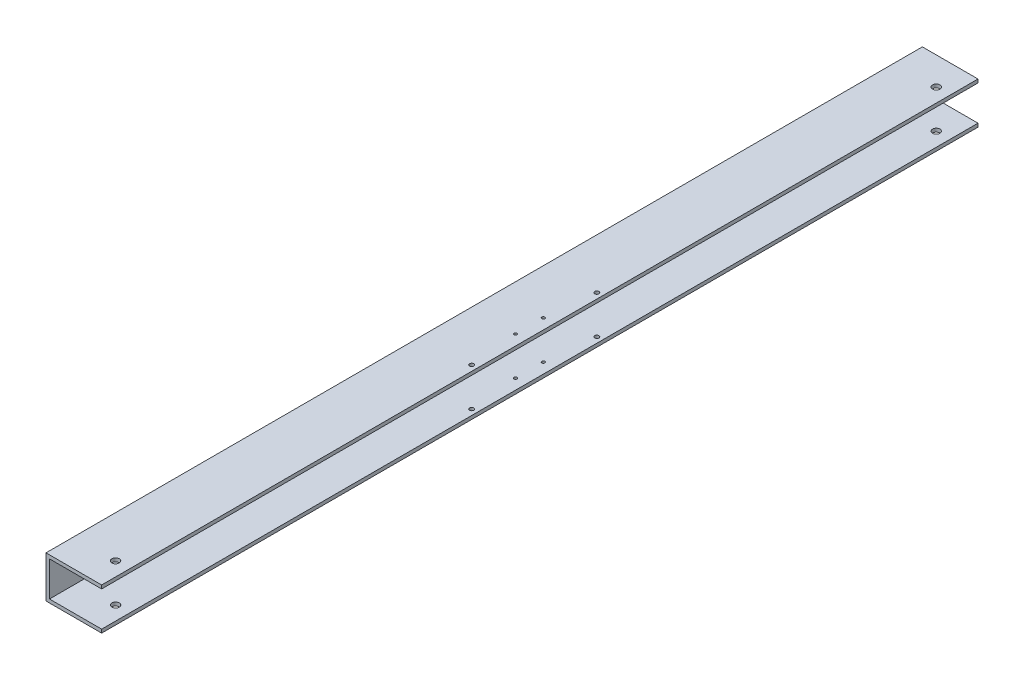
ISO-10303-21;
HEADER;
FILE_DESCRIPTION(('STEP AP214'),'2;1');
FILE_NAME('part.step','',(''),(''),'','','');
FILE_SCHEMA(('AUTOMOTIVE_DESIGN { 1 0 10303 214 1 1 1 1 }'));
ENDSEC;
DATA;
#1=APPLICATION_CONTEXT('core data for automotive mechanical design processes');
#2=APPLICATION_PROTOCOL_DEFINITION('international standard','automotive_design',2000,#1);
#3=PRODUCT_CONTEXT('',#1,'mechanical');
#4=PRODUCT('Part','Part','',(#3));
#5=PRODUCT_RELATED_PRODUCT_CATEGORY('part','',(#4));
#6=PRODUCT_DEFINITION_FORMATION('','',#4);
#7=PRODUCT_DEFINITION_CONTEXT('part definition',#1,'design');
#8=PRODUCT_DEFINITION('design','',#6,#7);
#9=PRODUCT_DEFINITION_SHAPE('','',#8);
#10=(LENGTH_UNIT() NAMED_UNIT(*) SI_UNIT(.MILLI.,.METRE.));
#11=(NAMED_UNIT(*) PLANE_ANGLE_UNIT() SI_UNIT($,.RADIAN.));
#12=(NAMED_UNIT(*) SI_UNIT($,.STERADIAN.) SOLID_ANGLE_UNIT());
#13=UNCERTAINTY_MEASURE_WITH_UNIT(LENGTH_MEASURE(1.E-05),#10,'distance_accuracy_value','');
#14=(GEOMETRIC_REPRESENTATION_CONTEXT(3) GLOBAL_UNCERTAINTY_ASSIGNED_CONTEXT((#13)) GLOBAL_UNIT_ASSIGNED_CONTEXT((#10,
#11,#12)) REPRESENTATION_CONTEXT('',''));
#15=CARTESIAN_POINT('',(0.,0.,0.));
#16=DIRECTION('',(0.,0.,1.));
#17=DIRECTION('',(1.,0.,0.));
#18=AXIS2_PLACEMENT_3D('',#15,#16,#17);
#19=CARTESIAN_POINT('',(-25.4,19.05,400.05));
#20=DIRECTION('',(0.,-1.,0.));
#21=DIRECTION('',(0.,0.,-1.));
#22=AXIS2_PLACEMENT_3D('',#19,#20,#21);
#23=PLANE('',#22);
#24=CARTESIAN_POINT('',(12.7,19.05,374.65));
#25=DIRECTION('',(0.,1.,0.));
#26=DIRECTION('',(0.,0.,1.));
#27=AXIS2_PLACEMENT_3D('',#24,#25,#26);
#28=CIRCLE('',#27,3.37819999999999);
#29=CARTESIAN_POINT('',(12.7,19.05,378.0282));
#30=VERTEX_POINT('',#29);
#31=EDGE_CURVE('E198',#30,#30,#28,.T.);
#32=ORIENTED_EDGE('',*,*,#31,.F.);
#33=EDGE_LOOP('',(#32));
#34=FACE_BOUND('',#33,.T.);
#35=CARTESIAN_POINT('',(20.32,19.05,57.15));
#36=DIRECTION('',(0.,1.,0.));
#37=DIRECTION('',(0.,0.,1.));
#38=AXIS2_PLACEMENT_3D('',#35,#36,#37);
#39=CIRCLE('',#38,1.89865);
#40=CARTESIAN_POINT('',(20.32,19.05,59.04865));
#41=VERTEX_POINT('',#40);
#42=EDGE_CURVE('E210',#41,#41,#39,.T.);
#43=ORIENTED_EDGE('',*,*,#42,.F.);
#44=EDGE_LOOP('',(#43));
#45=FACE_BOUND('',#44,.T.);
#46=CARTESIAN_POINT('',(15.8749999999999,19.05,12.7));
#47=DIRECTION('',(0.,1.,0.));
#48=DIRECTION('',(0.,0.,1.));
#49=AXIS2_PLACEMENT_3D('',#46,#47,#48);
#50=CIRCLE('',#49,1.35254999999999);
#51=CARTESIAN_POINT('',(15.8749999999999,19.05,14.05255));
#52=VERTEX_POINT('',#51);
#53=EDGE_CURVE('E226',#52,#52,#50,.T.);
#54=ORIENTED_EDGE('',*,*,#53,.F.);
#55=EDGE_LOOP('',(#54));
#56=FACE_BOUND('',#55,.T.);
#57=DIRECTION('',(-1.,0.,0.));
#58=VECTOR('',#57,1.);
#59=CARTESIAN_POINT('',(-25.4,19.05,-400.05));
#60=LINE('',#59,#58);
#61=CARTESIAN_POINT('',(25.4,19.05,-400.05));
#62=VERTEX_POINT('',#61);
#63=CARTESIAN_POINT('',(-25.4,19.05,-400.05));
#64=VERTEX_POINT('',#63);
#65=EDGE_CURVE('E128',#62,#64,#60,.T.);
#66=ORIENTED_EDGE('',*,*,#65,.T.);
#67=DIRECTION('',(0.,0.,-1.));
#68=VECTOR('',#67,1.);
#69=CARTESIAN_POINT('',(-25.4,19.05,400.05));
#70=LINE('',#69,#68);
#71=CARTESIAN_POINT('',(-25.4,19.05,400.05));
#72=VERTEX_POINT('',#71);
#73=EDGE_CURVE('E125',#72,#64,#70,.T.);
#74=ORIENTED_EDGE('',*,*,#73,.F.);
#75=DIRECTION('',(-1.,0.,0.));
#76=VECTOR('',#75,1.);
#77=CARTESIAN_POINT('',(-25.4,19.05,400.05));
#78=LINE('',#77,#76);
#79=CARTESIAN_POINT('',(25.4,19.05,400.05));
#80=VERTEX_POINT('',#79);
#81=EDGE_CURVE('E114',#80,#72,#78,.T.);
#82=ORIENTED_EDGE('',*,*,#81,.F.);
#83=DIRECTION('',(0.,0.,-1.));
#84=VECTOR('',#83,1.);
#85=CARTESIAN_POINT('',(25.4,19.05,400.05));
#86=LINE('',#85,#84);
#87=EDGE_CURVE('E129',#80,#62,#86,.T.);
#88=ORIENTED_EDGE('',*,*,#87,.T.);
#89=EDGE_LOOP('',(#66,#74,#82,#88));
#90=FACE_BOUND('',#89,.T.);
#91=CARTESIAN_POINT('',(12.7,19.05,-374.65));
#92=DIRECTION('',(0.,1.,0.));
#93=DIRECTION('',(0.,0.,1.));
#94=AXIS2_PLACEMENT_3D('',#91,#92,#93);
#95=CIRCLE('',#94,3.37819999999999);
#96=CARTESIAN_POINT('',(12.7,19.05,-371.2718));
#97=VERTEX_POINT('',#96);
#98=EDGE_CURVE('E192',#97,#97,#95,.T.);
#99=ORIENTED_EDGE('',*,*,#98,.F.);
#100=EDGE_LOOP('',(#99));
#101=FACE_BOUND('',#100,.T.);
#102=CARTESIAN_POINT('',(15.8749999999999,19.05,-12.7));
#103=DIRECTION('',(0.,1.,0.));
#104=DIRECTION('',(0.,0.,1.));
#105=AXIS2_PLACEMENT_3D('',#102,#103,#104);
#106=CIRCLE('',#105,1.35254999999999);
#107=CARTESIAN_POINT('',(15.8749999999999,19.05,-11.34745));
#108=VERTEX_POINT('',#107);
#109=EDGE_CURVE('E177',#108,#108,#106,.T.);
#110=ORIENTED_EDGE('',*,*,#109,.F.);
#111=EDGE_LOOP('',(#110));
#112=FACE_BOUND('',#111,.T.);
#113=CARTESIAN_POINT('',(20.32,19.05,-57.15));
#114=DIRECTION('',(0.,1.,0.));
#115=DIRECTION('',(0.,0.,1.));
#116=AXIS2_PLACEMENT_3D('',#113,#114,#115);
#117=CIRCLE('',#116,1.89865);
#118=CARTESIAN_POINT('',(20.32,19.05,-55.25135));
#119=VERTEX_POINT('',#118);
#120=EDGE_CURVE('E276',#119,#119,#117,.T.);
#121=ORIENTED_EDGE('',*,*,#120,.F.);
#122=EDGE_LOOP('',(#121));
#123=FACE_BOUND('',#122,.T.);
#124=ADVANCED_FACE('F38',(#34,#45,#56,#90,#101,#112,#123),#23,.F.);
#125=CARTESIAN_POINT('',(-25.4,-19.05,400.05));
#126=DIRECTION('',(0.,1.,0.));
#127=DIRECTION('',(0.,0.,1.));
#128=AXIS2_PLACEMENT_3D('',#125,#126,#127);
#129=PLANE('',#128);
#130=CARTESIAN_POINT('',(12.7,-19.05,-374.65));
#131=DIRECTION('',(0.,-1.,0.));
#132=DIRECTION('',(0.,0.,-1.));
#133=AXIS2_PLACEMENT_3D('',#130,#131,#132);
#134=CIRCLE('',#133,3.37819999999999);
#135=CARTESIAN_POINT('',(12.7,-19.05,-378.0282));
#136=VERTEX_POINT('',#135);
#137=EDGE_CURVE('E174',#136,#136,#134,.T.);
#138=ORIENTED_EDGE('',*,*,#137,.F.);
#139=EDGE_LOOP('',(#138));
#140=FACE_BOUND('',#139,.T.);
#141=CARTESIAN_POINT('',(12.7,-19.05,374.65));
#142=DIRECTION('',(0.,-1.,0.));
#143=DIRECTION('',(0.,0.,-1.));
#144=AXIS2_PLACEMENT_3D('',#141,#142,#143);
#145=CIRCLE('',#144,3.37819999999999);
#146=CARTESIAN_POINT('',(12.7,-19.05,371.2718));
#147=VERTEX_POINT('',#146);
#148=EDGE_CURVE('E204',#147,#147,#145,.T.);
#149=ORIENTED_EDGE('',*,*,#148,.F.);
#150=EDGE_LOOP('',(#149));
#151=FACE_BOUND('',#150,.T.);
#152=DIRECTION('',(1.,0.,0.));
#153=VECTOR('',#152,1.);
#154=CARTESIAN_POINT('',(-25.4,-19.05,-400.05));
#155=LINE('',#154,#153);
#156=CARTESIAN_POINT('',(-25.4,-19.05,-400.05));
#157=VERTEX_POINT('',#156);
#158=CARTESIAN_POINT('',(25.4,-19.05,-400.05));
#159=VERTEX_POINT('',#158);
#160=EDGE_CURVE('E93',#157,#159,#155,.T.);
#161=ORIENTED_EDGE('',*,*,#160,.T.);
#162=DIRECTION('',(0.,0.,-1.));
#163=VECTOR('',#162,1.);
#164=CARTESIAN_POINT('',(25.4,-19.05,400.05));
#165=LINE('',#164,#163);
#166=CARTESIAN_POINT('',(25.4,-19.05,400.05));
#167=VERTEX_POINT('',#166);
#168=EDGE_CURVE('E134',#167,#159,#165,.T.);
#169=ORIENTED_EDGE('',*,*,#168,.F.);
#170=DIRECTION('',(1.,0.,0.));
#171=VECTOR('',#170,1.);
#172=CARTESIAN_POINT('',(-25.4,-19.05,400.05));
#173=LINE('',#172,#171);
#174=CARTESIAN_POINT('',(-25.4,-19.05,400.05));
#175=VERTEX_POINT('',#174);
#176=EDGE_CURVE('E58',#175,#167,#173,.T.);
#177=ORIENTED_EDGE('',*,*,#176,.F.);
#178=DIRECTION('',(0.,0.,-1.));
#179=VECTOR('',#178,1.);
#180=CARTESIAN_POINT('',(-25.4,-19.05,400.05));
#181=LINE('',#180,#179);
#182=EDGE_CURVE('E130',#175,#157,#181,.T.);
#183=ORIENTED_EDGE('',*,*,#182,.T.);
#184=EDGE_LOOP('',(#161,#169,#177,#183));
#185=FACE_BOUND('',#184,.T.);
#186=CARTESIAN_POINT('',(15.8749999999999,-19.05,12.7));
#187=DIRECTION('',(0.,1.,0.));
#188=DIRECTION('',(0.,0.,1.));
#189=AXIS2_PLACEMENT_3D('',#186,#187,#188);
#190=CIRCLE('',#189,1.35254999999999);
#191=CARTESIAN_POINT('',(15.8749999999999,-19.05,14.05255));
#192=VERTEX_POINT('',#191);
#193=EDGE_CURVE('E227',#192,#192,#190,.F.);
#194=ORIENTED_EDGE('',*,*,#193,.F.);
#195=EDGE_LOOP('',(#194));
#196=FACE_BOUND('',#195,.T.);
#197=CARTESIAN_POINT('',(20.32,-19.05,57.15));
#198=DIRECTION('',(0.,1.,0.));
#199=DIRECTION('',(0.,0.,1.));
#200=AXIS2_PLACEMENT_3D('',#197,#198,#199);
#201=CIRCLE('',#200,1.89864999999999);
#202=CARTESIAN_POINT('',(20.32,-19.05,59.04865));
#203=VERTEX_POINT('',#202);
#204=EDGE_CURVE('E211',#203,#203,#201,.F.);
#205=ORIENTED_EDGE('',*,*,#204,.F.);
#206=EDGE_LOOP('',(#205));
#207=FACE_BOUND('',#206,.T.);
#208=CARTESIAN_POINT('',(15.8749999999999,-19.05,-12.7));
#209=DIRECTION('',(0.,1.,0.));
#210=DIRECTION('',(0.,0.,1.));
#211=AXIS2_PLACEMENT_3D('',#208,#209,#210);
#212=CIRCLE('',#211,1.35254999999999);
#213=CARTESIAN_POINT('',(15.8749999999999,-19.05,-11.34745));
#214=VERTEX_POINT('',#213);
#215=EDGE_CURVE('E170',#214,#214,#212,.F.);
#216=ORIENTED_EDGE('',*,*,#215,.F.);
#217=EDGE_LOOP('',(#216));
#218=FACE_BOUND('',#217,.T.);
#219=CARTESIAN_POINT('',(20.32,-19.05,-57.15));
#220=DIRECTION('',(0.,1.,0.));
#221=DIRECTION('',(0.,0.,1.));
#222=AXIS2_PLACEMENT_3D('',#219,#220,#221);
#223=CIRCLE('',#222,1.89864999999999);
#224=CARTESIAN_POINT('',(20.32,-19.05,-55.25135));
#225=VERTEX_POINT('',#224);
#226=EDGE_CURVE('E274',#225,#225,#223,.F.);
#227=ORIENTED_EDGE('',*,*,#226,.F.);
#228=EDGE_LOOP('',(#227));
#229=FACE_BOUND('',#228,.T.);
#230=ADVANCED_FACE('F262',(#140,#151,#185,#196,#207,#218,#229),#129,.F.);
#231=CARTESIAN_POINT('',(25.4,-15.875,400.05));
#232=DIRECTION('',(-1.,0.,0.));
#233=DIRECTION('',(0.,0.,1.));
#234=AXIS2_PLACEMENT_3D('',#231,#232,#233);
#235=PLANE('',#234);
#236=DIRECTION('',(0.,1.,0.));
#237=VECTOR('',#236,1.);
#238=CARTESIAN_POINT('',(25.4,-15.875,-400.05));
#239=LINE('',#238,#237);
#240=CARTESIAN_POINT('',(25.4,-15.875,-400.05));
#241=VERTEX_POINT('',#240);
#242=EDGE_CURVE('E138',#159,#241,#239,.T.);
#243=ORIENTED_EDGE('',*,*,#242,.T.);
#244=DIRECTION('',(0.,0.,-1.));
#245=VECTOR('',#244,1.);
#246=CARTESIAN_POINT('',(25.4,-15.875,400.05));
#247=LINE('',#246,#245);
#248=CARTESIAN_POINT('',(25.4,-15.875,400.05));
#249=VERTEX_POINT('',#248);
#250=EDGE_CURVE('E11',#249,#241,#247,.T.);
#251=ORIENTED_EDGE('',*,*,#250,.F.);
#252=DIRECTION('',(0.,1.,0.));
#253=VECTOR('',#252,1.);
#254=CARTESIAN_POINT('',(25.4,-15.875,400.05));
#255=LINE('',#254,#253);
#256=EDGE_CURVE('E153',#167,#249,#255,.T.);
#257=ORIENTED_EDGE('',*,*,#256,.F.);
#258=ORIENTED_EDGE('',*,*,#168,.T.);
#259=EDGE_LOOP('',(#243,#251,#257,#258));
#260=FACE_BOUND('',#259,.T.);
#261=ADVANCED_FACE('F40',(#260),#235,.F.);
#262=CARTESIAN_POINT('',(-22.225,-15.875,400.05));
#263=DIRECTION('',(0.,-1.,0.));
#264=DIRECTION('',(0.,0.,-1.));
#265=AXIS2_PLACEMENT_3D('',#262,#263,#264);
#266=PLANE('',#265);
#267=CARTESIAN_POINT('',(20.32,-15.875,-57.15));
#268=DIRECTION('',(0.,-1.,0.));
#269=DIRECTION('',(0.,0.,-1.));
#270=AXIS2_PLACEMENT_3D('',#267,#268,#269);
#271=CIRCLE('',#270,1.89864999999999);
#272=CARTESIAN_POINT('',(20.32,-15.875,-55.25135));
#273=VERTEX_POINT('',#272);
#274=EDGE_CURVE('E182',#273,#273,#271,.T.);
#275=ORIENTED_EDGE('',*,*,#274,.T.);
#276=EDGE_LOOP('',(#275));
#277=FACE_BOUND('',#276,.T.);
#278=CARTESIAN_POINT('',(15.8749999999999,-15.875,-12.7));
#279=DIRECTION('',(0.,-1.,0.));
#280=DIRECTION('',(0.,0.,-1.));
#281=AXIS2_PLACEMENT_3D('',#278,#279,#280);
#282=CIRCLE('',#281,1.35254999999999);
#283=CARTESIAN_POINT('',(15.8749999999999,-15.875,-11.34745));
#284=VERTEX_POINT('',#283);
#285=EDGE_CURVE('E169',#284,#284,#282,.T.);
#286=ORIENTED_EDGE('',*,*,#285,.T.);
#287=EDGE_LOOP('',(#286));
#288=FACE_BOUND('',#287,.T.);
#289=CARTESIAN_POINT('',(12.7,-15.875,-374.65));
#290=DIRECTION('',(0.,-1.,0.));
#291=DIRECTION('',(0.,0.,-1.));
#292=AXIS2_PLACEMENT_3D('',#289,#290,#291);
#293=CIRCLE('',#292,3.37819999999999);
#294=CARTESIAN_POINT('',(12.7,-15.875,-378.0282));
#295=VERTEX_POINT('',#294);
#296=EDGE_CURVE('E189',#295,#295,#293,.T.);
#297=ORIENTED_EDGE('',*,*,#296,.T.);
#298=EDGE_LOOP('',(#297));
#299=FACE_BOUND('',#298,.T.);
#300=CARTESIAN_POINT('',(12.7,-15.875,374.65));
#301=DIRECTION('',(0.,-1.,0.));
#302=DIRECTION('',(0.,0.,-1.));
#303=AXIS2_PLACEMENT_3D('',#300,#301,#302);
#304=CIRCLE('',#303,3.37819999999999);
#305=CARTESIAN_POINT('',(12.7,-15.875,371.2718));
#306=VERTEX_POINT('',#305);
#307=EDGE_CURVE('E207',#306,#306,#304,.T.);
#308=ORIENTED_EDGE('',*,*,#307,.T.);
#309=EDGE_LOOP('',(#308));
#310=FACE_BOUND('',#309,.T.);
#311=CARTESIAN_POINT('',(20.32,-15.875,57.15));
#312=DIRECTION('',(0.,-1.,0.));
#313=DIRECTION('',(0.,0.,-1.));
#314=AXIS2_PLACEMENT_3D('',#311,#312,#313);
#315=CIRCLE('',#314,1.89864999999999);
#316=CARTESIAN_POINT('',(20.32,-15.875,59.04865));
#317=VERTEX_POINT('',#316);
#318=EDGE_CURVE('E222',#317,#317,#315,.T.);
#319=ORIENTED_EDGE('',*,*,#318,.T.);
#320=EDGE_LOOP('',(#319));
#321=FACE_BOUND('',#320,.T.);
#322=CARTESIAN_POINT('',(15.8749999999999,-15.875,12.7));
#323=DIRECTION('',(0.,-1.,0.));
#324=DIRECTION('',(0.,0.,-1.));
#325=AXIS2_PLACEMENT_3D('',#322,#323,#324);
#326=CIRCLE('',#325,1.35254999999999);
#327=CARTESIAN_POINT('',(15.8749999999999,-15.875,14.05255));
#328=VERTEX_POINT('',#327);
#329=EDGE_CURVE('E142',#328,#328,#326,.T.);
#330=ORIENTED_EDGE('',*,*,#329,.T.);
#331=EDGE_LOOP('',(#330));
#332=FACE_BOUND('',#331,.T.);
#333=DIRECTION('',(-1.,0.,0.));
#334=VECTOR('',#333,1.);
#335=CARTESIAN_POINT('',(-22.225,-15.875,-400.05));
#336=LINE('',#335,#334);
#337=CARTESIAN_POINT('',(-22.225,-15.875,-400.05));
#338=VERTEX_POINT('',#337);
#339=EDGE_CURVE('E141',#241,#338,#336,.T.);
#340=ORIENTED_EDGE('',*,*,#339,.T.);
#341=DIRECTION('',(0.,0.,-1.));
#342=VECTOR('',#341,1.);
#343=CARTESIAN_POINT('',(-22.225,-15.875,400.05));
#344=LINE('',#343,#342);
#345=CARTESIAN_POINT('',(-22.225,-15.875,400.05));
#346=VERTEX_POINT('',#345);
#347=EDGE_CURVE('E49',#346,#338,#344,.T.);
#348=ORIENTED_EDGE('',*,*,#347,.F.);
#349=DIRECTION('',(-1.,0.,0.));
#350=VECTOR('',#349,1.);
#351=CARTESIAN_POINT('',(-22.225,-15.875,400.05));
#352=LINE('',#351,#350);
#353=EDGE_CURVE('E101',#249,#346,#352,.T.);
#354=ORIENTED_EDGE('',*,*,#353,.F.);
#355=ORIENTED_EDGE('',*,*,#250,.T.);
#356=EDGE_LOOP('',(#340,#348,#354,#355));
#357=FACE_BOUND('',#356,.T.);
#358=ADVANCED_FACE('F301',(#277,#288,#299,#310,#321,#332,#357),#266,.F.);
#359=CARTESIAN_POINT('',(-22.225,15.875,400.05));
#360=DIRECTION('',(-1.,0.,0.));
#361=DIRECTION('',(0.,-1.,0.));
#362=AXIS2_PLACEMENT_3D('',#359,#360,#361);
#363=PLANE('',#362);
#364=DIRECTION('',(0.,1.,0.));
#365=VECTOR('',#364,1.);
#366=CARTESIAN_POINT('',(-22.225,15.875,-400.05));
#367=LINE('',#366,#365);
#368=CARTESIAN_POINT('',(-22.225,15.875,-400.05));
#369=VERTEX_POINT('',#368);
#370=EDGE_CURVE('E144',#338,#369,#367,.T.);
#371=ORIENTED_EDGE('',*,*,#370,.T.);
#372=DIRECTION('',(0.,0.,-1.));
#373=VECTOR('',#372,1.);
#374=CARTESIAN_POINT('',(-22.225,15.875,400.05));
#375=LINE('',#374,#373);
#376=CARTESIAN_POINT('',(-22.225,15.875,400.05));
#377=VERTEX_POINT('',#376);
#378=EDGE_CURVE('E163',#377,#369,#375,.T.);
#379=ORIENTED_EDGE('',*,*,#378,.F.);
#380=DIRECTION('',(0.,1.,0.));
#381=VECTOR('',#380,1.);
#382=CARTESIAN_POINT('',(-22.225,15.875,400.05));
#383=LINE('',#382,#381);
#384=EDGE_CURVE('E242',#346,#377,#383,.T.);
#385=ORIENTED_EDGE('',*,*,#384,.F.);
#386=ORIENTED_EDGE('',*,*,#347,.T.);
#387=EDGE_LOOP('',(#371,#379,#385,#386));
#388=FACE_BOUND('',#387,.T.);
#389=ADVANCED_FACE('F298',(#388),#363,.F.);
#390=CARTESIAN_POINT('',(-22.225,15.875,400.05));
#391=DIRECTION('',(0.,1.,0.));
#392=DIRECTION('',(0.,0.,1.));
#393=AXIS2_PLACEMENT_3D('',#390,#391,#392);
#394=PLANE('',#393);
#395=CARTESIAN_POINT('',(20.32,15.875,-57.15));
#396=DIRECTION('',(0.,1.,0.));
#397=DIRECTION('',(0.,0.,1.));
#398=AXIS2_PLACEMENT_3D('',#395,#396,#397);
#399=CIRCLE('',#398,1.89864999999999);
#400=CARTESIAN_POINT('',(20.32,15.875,-55.25135));
#401=VERTEX_POINT('',#400);
#402=EDGE_CURVE('E42',#401,#401,#399,.T.);
#403=ORIENTED_EDGE('',*,*,#402,.T.);
#404=EDGE_LOOP('',(#403));
#405=FACE_BOUND('',#404,.T.);
#406=CARTESIAN_POINT('',(15.8749999999999,15.875,-12.7));
#407=DIRECTION('',(0.,1.,0.));
#408=DIRECTION('',(0.,0.,1.));
#409=AXIS2_PLACEMENT_3D('',#406,#407,#408);
#410=CIRCLE('',#409,1.35254999999999);
#411=CARTESIAN_POINT('',(15.8749999999999,15.875,-11.34745));
#412=VERTEX_POINT('',#411);
#413=EDGE_CURVE('E167',#412,#412,#410,.T.);
#414=ORIENTED_EDGE('',*,*,#413,.T.);
#415=EDGE_LOOP('',(#414));
#416=FACE_BOUND('',#415,.T.);
#417=CARTESIAN_POINT('',(12.7,15.875,-374.65));
#418=DIRECTION('',(0.,1.,0.));
#419=DIRECTION('',(0.,0.,1.));
#420=AXIS2_PLACEMENT_3D('',#417,#418,#419);
#421=CIRCLE('',#420,3.37819999999999);
#422=CARTESIAN_POINT('',(12.7,15.875,-371.2718));
#423=VERTEX_POINT('',#422);
#424=EDGE_CURVE('E195',#423,#423,#421,.T.);
#425=ORIENTED_EDGE('',*,*,#424,.T.);
#426=EDGE_LOOP('',(#425));
#427=FACE_BOUND('',#426,.T.);
#428=CARTESIAN_POINT('',(12.7,15.875,374.65));
#429=DIRECTION('',(0.,1.,0.));
#430=DIRECTION('',(0.,0.,1.));
#431=AXIS2_PLACEMENT_3D('',#428,#429,#430);
#432=CIRCLE('',#431,3.37819999999999);
#433=CARTESIAN_POINT('',(12.7,15.875,378.0282));
#434=VERTEX_POINT('',#433);
#435=EDGE_CURVE('E201',#434,#434,#432,.T.);
#436=ORIENTED_EDGE('',*,*,#435,.T.);
#437=EDGE_LOOP('',(#436));
#438=FACE_BOUND('',#437,.T.);
#439=CARTESIAN_POINT('',(20.32,15.875,57.15));
#440=DIRECTION('',(0.,1.,0.));
#441=DIRECTION('',(0.,0.,1.));
#442=AXIS2_PLACEMENT_3D('',#439,#440,#441);
#443=CIRCLE('',#442,1.89864999999999);
#444=CARTESIAN_POINT('',(20.32,15.875,59.04865));
#445=VERTEX_POINT('',#444);
#446=EDGE_CURVE('E215',#445,#445,#443,.T.);
#447=ORIENTED_EDGE('',*,*,#446,.T.);
#448=EDGE_LOOP('',(#447));
#449=FACE_BOUND('',#448,.T.);
#450=CARTESIAN_POINT('',(15.8749999999999,15.875,12.7));
#451=DIRECTION('',(0.,1.,0.));
#452=DIRECTION('',(0.,0.,1.));
#453=AXIS2_PLACEMENT_3D('',#450,#451,#452);
#454=CIRCLE('',#453,1.35254999999999);
#455=CARTESIAN_POINT('',(15.8749999999999,15.875,14.05255));
#456=VERTEX_POINT('',#455);
#457=EDGE_CURVE('E230',#456,#456,#454,.T.);
#458=ORIENTED_EDGE('',*,*,#457,.T.);
#459=EDGE_LOOP('',(#458));
#460=FACE_BOUND('',#459,.T.);
#461=DIRECTION('',(1.,0.,0.));
#462=VECTOR('',#461,1.);
#463=CARTESIAN_POINT('',(-22.225,15.875,-400.05));
#464=LINE('',#463,#462);
#465=CARTESIAN_POINT('',(25.4,15.875,-400.05));
#466=VERTEX_POINT('',#465);
#467=EDGE_CURVE('E146',#369,#466,#464,.T.);
#468=ORIENTED_EDGE('',*,*,#467,.T.);
#469=DIRECTION('',(0.,0.,-1.));
#470=VECTOR('',#469,1.);
#471=CARTESIAN_POINT('',(25.4,15.875,400.05));
#472=LINE('',#471,#470);
#473=CARTESIAN_POINT('',(25.4,15.875,400.05));
#474=VERTEX_POINT('',#473);
#475=EDGE_CURVE('E159',#474,#466,#472,.T.);
#476=ORIENTED_EDGE('',*,*,#475,.F.);
#477=DIRECTION('',(1.,0.,0.));
#478=VECTOR('',#477,1.);
#479=CARTESIAN_POINT('',(-22.225,15.875,400.05));
#480=LINE('',#479,#478);
#481=EDGE_CURVE('E244',#377,#474,#480,.T.);
#482=ORIENTED_EDGE('',*,*,#481,.F.);
#483=ORIENTED_EDGE('',*,*,#378,.T.);
#484=EDGE_LOOP('',(#468,#476,#482,#483));
#485=FACE_BOUND('',#484,.T.);
#486=ADVANCED_FACE('F250',(#405,#416,#427,#438,#449,#460,#485),#394,.F.);
#487=CARTESIAN_POINT('',(25.4,19.05,400.05));
#488=DIRECTION('',(-1.,0.,0.));
#489=DIRECTION('',(0.,0.,1.));
#490=AXIS2_PLACEMENT_3D('',#487,#488,#489);
#491=PLANE('',#490);
#492=DIRECTION('',(0.,1.,0.));
#493=VECTOR('',#492,1.);
#494=CARTESIAN_POINT('',(25.4,19.05,-400.05));
#495=LINE('',#494,#493);
#496=EDGE_CURVE('E148',#466,#62,#495,.T.);
#497=ORIENTED_EDGE('',*,*,#496,.T.);
#498=ORIENTED_EDGE('',*,*,#87,.F.);
#499=DIRECTION('',(0.,1.,0.));
#500=VECTOR('',#499,1.);
#501=CARTESIAN_POINT('',(25.4,19.05,400.05));
#502=LINE('',#501,#500);
#503=EDGE_CURVE('E120',#474,#80,#502,.T.);
#504=ORIENTED_EDGE('',*,*,#503,.F.);
#505=ORIENTED_EDGE('',*,*,#475,.T.);
#506=EDGE_LOOP('',(#497,#498,#504,#505));
#507=FACE_BOUND('',#506,.T.);
#508=ADVANCED_FACE('F254',(#507),#491,.F.);
#509=CARTESIAN_POINT('',(-25.4,19.05,400.05));
#510=DIRECTION('',(1.,0.,0.));
#511=DIRECTION('',(0.,1.,0.));
#512=AXIS2_PLACEMENT_3D('',#509,#510,#511);
#513=PLANE('',#512);
#514=DIRECTION('',(0.,-1.,0.));
#515=VECTOR('',#514,1.);
#516=CARTESIAN_POINT('',(-25.4,19.05,-400.05));
#517=LINE('',#516,#515);
#518=EDGE_CURVE('E87',#64,#157,#517,.T.);
#519=ORIENTED_EDGE('',*,*,#518,.T.);
#520=ORIENTED_EDGE('',*,*,#182,.F.);
#521=DIRECTION('',(0.,-1.,0.));
#522=VECTOR('',#521,1.);
#523=CARTESIAN_POINT('',(-25.4,19.05,400.05));
#524=LINE('',#523,#522);
#525=EDGE_CURVE('E118',#72,#175,#524,.T.);
#526=ORIENTED_EDGE('',*,*,#525,.F.);
#527=ORIENTED_EDGE('',*,*,#73,.T.);
#528=EDGE_LOOP('',(#519,#520,#526,#527));
#529=FACE_BOUND('',#528,.T.);
#530=ADVANCED_FACE('F132',(#529),#513,.F.);
#531=CARTESIAN_POINT('',(0.,0.,400.05));
#532=DIRECTION('',(0.,0.,1.));
#533=DIRECTION('',(1.,0.,0.));
#534=AXIS2_PLACEMENT_3D('',#531,#532,#533);
#535=PLANE('',#534);
#536=ORIENTED_EDGE('',*,*,#256,.T.);
#537=ORIENTED_EDGE('',*,*,#353,.T.);
#538=ORIENTED_EDGE('',*,*,#384,.T.);
#539=ORIENTED_EDGE('',*,*,#481,.T.);
#540=ORIENTED_EDGE('',*,*,#503,.T.);
#541=ORIENTED_EDGE('',*,*,#81,.T.);
#542=ORIENTED_EDGE('',*,*,#525,.T.);
#543=ORIENTED_EDGE('',*,*,#176,.T.);
#544=EDGE_LOOP('',(#536,#537,#538,#539,#540,#541,#542,#543));
#545=FACE_BOUND('',#544,.T.);
#546=ADVANCED_FACE('F116',(#545),#535,.T.);
#547=CARTESIAN_POINT('',(0.,0.,-400.05));
#548=DIRECTION('',(0.,0.,1.));
#549=DIRECTION('',(1.,0.,0.));
#550=AXIS2_PLACEMENT_3D('',#547,#548,#549);
#551=PLANE('',#550);
#552=ORIENTED_EDGE('',*,*,#242,.F.);
#553=ORIENTED_EDGE('',*,*,#160,.F.);
#554=ORIENTED_EDGE('',*,*,#518,.F.);
#555=ORIENTED_EDGE('',*,*,#65,.F.);
#556=ORIENTED_EDGE('',*,*,#496,.F.);
#557=ORIENTED_EDGE('',*,*,#467,.F.);
#558=ORIENTED_EDGE('',*,*,#370,.F.);
#559=ORIENTED_EDGE('',*,*,#339,.F.);
#560=EDGE_LOOP('',(#552,#553,#554,#555,#556,#557,#558,#559));
#561=FACE_BOUND('',#560,.T.);
#562=ADVANCED_FACE('F257',(#561),#551,.F.);
#563=CARTESIAN_POINT('',(15.8749999999999,19.05,12.7));
#564=DIRECTION('',(0.,1.,0.));
#565=DIRECTION('',(0.,0.,1.));
#566=AXIS2_PLACEMENT_3D('',#563,#564,#565);
#567=CYLINDRICAL_SURFACE('',#566,1.35254999999999);
#568=ORIENTED_EDGE('',*,*,#53,.T.);
#569=EDGE_LOOP('',(#568));
#570=FACE_BOUND('',#569,.T.);
#571=ORIENTED_EDGE('',*,*,#457,.F.);
#572=EDGE_LOOP('',(#571));
#573=FACE_BOUND('',#572,.T.);
#574=ADVANCED_FACE('F324',(#570,#573),#567,.F.);
#575=CARTESIAN_POINT('',(15.8749999999999,-19.05,14.05255));
#576=CARTESIAN_POINT('',(15.8749999999999,-19.0169270833333,14.05255));
#577=CARTESIAN_POINT('',(15.8749999999999,-18.9838541666667,14.05255));
#578=CARTESIAN_POINT('',(15.8749999999999,-18.9177083333333,14.05255));
#579=CARTESIAN_POINT('',(15.8749999999999,-18.8846354166667,14.05255));
#580=CARTESIAN_POINT('',(15.8749999999999,-18.8184895833333,14.05255));
#581=CARTESIAN_POINT('',(15.8749999999999,-18.7854166666667,14.05255));
#582=CARTESIAN_POINT('',(15.8749999999999,-18.7192708333333,14.05255));
#583=CARTESIAN_POINT('',(15.8749999999999,-18.6861979166667,14.05255));
#584=CARTESIAN_POINT('',(15.8749999999999,-18.6200520833333,14.05255));
#585=CARTESIAN_POINT('',(15.8749999999999,-18.5869791666667,14.05255));
#586=CARTESIAN_POINT('',(15.8749999999999,-18.5208333333333,14.05255));
#587=CARTESIAN_POINT('',(15.8749999999999,-18.4877604166667,14.05255));
#588=CARTESIAN_POINT('',(15.8749999999999,-18.4216145833333,14.05255));
#589=CARTESIAN_POINT('',(15.8749999999999,-18.3885416666667,14.05255));
#590=CARTESIAN_POINT('',(15.8749999999999,-18.3223958333333,14.05255));
#591=CARTESIAN_POINT('',(15.8749999999999,-18.2893229166667,14.05255));
#592=CARTESIAN_POINT('',(15.8749999999999,-18.2231770833333,14.05255));
#593=CARTESIAN_POINT('',(15.8749999999999,-18.1901041666667,14.05255));
#594=CARTESIAN_POINT('',(15.8749999999999,-18.1239583333333,14.05255));
#595=CARTESIAN_POINT('',(15.8749999999999,-18.0908854166667,14.05255));
#596=CARTESIAN_POINT('',(15.8749999999999,-18.0247395833333,14.05255));
#597=CARTESIAN_POINT('',(15.8749999999999,-17.9916666666667,14.05255));
#598=CARTESIAN_POINT('',(15.8749999999999,-17.9255208333333,14.05255));
#599=CARTESIAN_POINT('',(15.8749999999999,-17.8924479166667,14.05255));
#600=CARTESIAN_POINT('',(15.8749999999999,-17.8263020833333,14.05255));
#601=CARTESIAN_POINT('',(15.8749999999999,-17.7932291666667,14.05255));
#602=CARTESIAN_POINT('',(15.8749999999999,-17.7270833333333,14.05255));
#603=CARTESIAN_POINT('',(15.8749999999999,-17.6940104166667,14.05255));
#604=CARTESIAN_POINT('',(15.8749999999999,-17.6278645833333,14.05255));
#605=CARTESIAN_POINT('',(15.8749999999999,-17.5947916666667,14.05255));
#606=CARTESIAN_POINT('',(15.8749999999999,-17.5286458333333,14.05255));
#607=CARTESIAN_POINT('',(15.8749999999999,-17.4955729166667,14.05255));
#608=CARTESIAN_POINT('',(15.8749999999999,-17.4294270833333,14.05255));
#609=CARTESIAN_POINT('',(15.8749999999999,-17.3963541666667,14.05255));
#610=CARTESIAN_POINT('',(15.8749999999999,-17.3302083333333,14.05255));
#611=CARTESIAN_POINT('',(15.8749999999999,-17.2971354166667,14.05255));
#612=CARTESIAN_POINT('',(15.8749999999999,-17.2309895833333,14.05255));
#613=CARTESIAN_POINT('',(15.8749999999999,-17.1979166666667,14.05255));
#614=CARTESIAN_POINT('',(15.8749999999999,-17.1317708333333,14.05255));
#615=CARTESIAN_POINT('',(15.8749999999999,-17.0986979166667,14.05255));
#616=CARTESIAN_POINT('',(15.8749999999999,-17.0325520833333,14.05255));
#617=CARTESIAN_POINT('',(15.8749999999999,-16.9994791666667,14.05255));
#618=CARTESIAN_POINT('',(15.8749999999999,-16.9333333333333,14.05255));
#619=CARTESIAN_POINT('',(15.8749999999999,-16.9002604166667,14.05255));
#620=CARTESIAN_POINT('',(15.8749999999999,-16.8341145833333,14.05255));
#621=CARTESIAN_POINT('',(15.8749999999999,-16.8010416666667,14.05255));
#622=CARTESIAN_POINT('',(15.8749999999999,-16.7348958333333,14.05255));
#623=CARTESIAN_POINT('',(15.8749999999999,-16.7018229166667,14.05255));
#624=CARTESIAN_POINT('',(15.8749999999999,-16.6356770833333,14.05255));
#625=CARTESIAN_POINT('',(15.8749999999999,-16.6026041666667,14.05255));
#626=CARTESIAN_POINT('',(15.8749999999999,-16.5364583333333,14.05255));
#627=CARTESIAN_POINT('',(15.8749999999999,-16.5033854166667,14.05255));
#628=CARTESIAN_POINT('',(15.8749999999999,-16.4372395833333,14.05255));
#629=CARTESIAN_POINT('',(15.8749999999999,-16.4041666666667,14.05255));
#630=CARTESIAN_POINT('',(15.8749999999999,-16.3380208333333,14.05255));
#631=CARTESIAN_POINT('',(15.8749999999999,-16.3049479166667,14.05255));
#632=CARTESIAN_POINT('',(15.8749999999999,-16.2388020833333,14.05255));
#633=CARTESIAN_POINT('',(15.8749999999999,-16.2057291666667,14.05255));
#634=CARTESIAN_POINT('',(15.8749999999999,-16.1395833333333,14.05255));
#635=CARTESIAN_POINT('',(15.8749999999999,-16.1065104166667,14.05255));
#636=CARTESIAN_POINT('',(15.8749999999999,-16.0403645833333,14.05255));
#637=CARTESIAN_POINT('',(15.8749999999999,-16.0072916666667,14.05255));
#638=CARTESIAN_POINT('',(15.8749999999999,-15.9411458333333,14.05255));
#639=CARTESIAN_POINT('',(15.8749999999999,-15.9080729166667,14.05255));
#640=CARTESIAN_POINT('',(15.8749999999999,-15.875,14.05255));
#641=B_SPLINE_CURVE_WITH_KNOTS('',3,(#575,#576,#577,#578,#579,#580,#581,#582,#583,#584,#585,
#586,#587,#588,#589,#590,#591,#592,#593,#594,#595,#596,#597,#598,#599,#600,#601,#602,#603,#604,
#605,#606,#607,#608,#609,#610,#611,#612,#613,#614,#615,#616,#617,#618,#619,#620,#621,#622,#623,
#624,#625,#626,#627,#628,#629,#630,#631,#632,#633,#634,#635,#636,#637,#638,#639,#640),
.UNSPECIFIED.,.F.,.F.,(4,2,2,2,2,2,2,2,2,2,2,2,2,2,2,2,2,2,2,2,2,2,2,2,2,2,2,2,2,2,2,2,4),(0.,
0.0992187499999977,0.198437500000002,0.29765625,0.396875000000005,0.496093750000003,0.5953125,
0.694531250000005,0.793750000000003,0.892968750000001,0.992187500000005,1.09140625,1.190625,
1.28984375000001,1.3890625,1.48828125000001,1.58750000000001,1.68671875,1.78593750000001,
1.88515625000001,1.98437500000001,2.08359375000001,2.18281250000001,2.28203125000001,
2.38125000000001,2.48046875000001,2.57968750000001,2.67890625000001,2.77812500000001,
2.87734375000001,2.97656250000001,3.07578125000001,3.17500000000001),.UNSPECIFIED.);
#642=EDGE_CURVE('BSEAM321',#192,#328,#641,.T.);
#643=ORIENTED_EDGE('',*,*,#193,.T.);
#644=ORIENTED_EDGE('',*,*,#329,.F.);
#645=ORIENTED_EDGE('',*,*,#642,.T.);
#646=ORIENTED_EDGE('',*,*,#642,.F.);
#647=EDGE_LOOP('',(#643,#645,#644,#646));
#648=FACE_BOUND('',#647,.T.);
#649=ADVANCED_FACE('F321',(#648),#567,.F.);
#650=CARTESIAN_POINT('',(20.32,19.05,57.15));
#651=DIRECTION('',(0.,1.,0.));
#652=DIRECTION('',(0.,0.,1.));
#653=AXIS2_PLACEMENT_3D('',#650,#651,#652);
#654=CYLINDRICAL_SURFACE('',#653,1.89864999999999);
#655=ORIENTED_EDGE('',*,*,#42,.T.);
#656=EDGE_LOOP('',(#655));
#657=FACE_BOUND('',#656,.T.);
#658=ORIENTED_EDGE('',*,*,#446,.F.);
#659=EDGE_LOOP('',(#658));
#660=FACE_BOUND('',#659,.T.);
#661=ADVANCED_FACE('F323',(#657,#660),#654,.F.);
#662=CARTESIAN_POINT('',(20.32,-19.05,59.04865));
#663=CARTESIAN_POINT('',(20.32,-19.0169270833333,59.04865));
#664=CARTESIAN_POINT('',(20.32,-18.9838541666667,59.04865));
#665=CARTESIAN_POINT('',(20.32,-18.9177083333333,59.04865));
#666=CARTESIAN_POINT('',(20.32,-18.8846354166667,59.04865));
#667=CARTESIAN_POINT('',(20.32,-18.8184895833333,59.04865));
#668=CARTESIAN_POINT('',(20.32,-18.7854166666667,59.04865));
#669=CARTESIAN_POINT('',(20.32,-18.7192708333333,59.04865));
#670=CARTESIAN_POINT('',(20.32,-18.6861979166667,59.04865));
#671=CARTESIAN_POINT('',(20.32,-18.6200520833333,59.04865));
#672=CARTESIAN_POINT('',(20.32,-18.5869791666667,59.04865));
#673=CARTESIAN_POINT('',(20.32,-18.5208333333333,59.04865));
#674=CARTESIAN_POINT('',(20.32,-18.4877604166667,59.04865));
#675=CARTESIAN_POINT('',(20.32,-18.4216145833333,59.04865));
#676=CARTESIAN_POINT('',(20.32,-18.3885416666667,59.04865));
#677=CARTESIAN_POINT('',(20.32,-18.3223958333333,59.04865));
#678=CARTESIAN_POINT('',(20.32,-18.2893229166667,59.04865));
#679=CARTESIAN_POINT('',(20.32,-18.2231770833333,59.04865));
#680=CARTESIAN_POINT('',(20.32,-18.1901041666667,59.04865));
#681=CARTESIAN_POINT('',(20.32,-18.1239583333333,59.04865));
#682=CARTESIAN_POINT('',(20.32,-18.0908854166667,59.04865));
#683=CARTESIAN_POINT('',(20.32,-18.0247395833333,59.04865));
#684=CARTESIAN_POINT('',(20.32,-17.9916666666667,59.04865));
#685=CARTESIAN_POINT('',(20.32,-17.9255208333333,59.04865));
#686=CARTESIAN_POINT('',(20.32,-17.8924479166667,59.04865));
#687=CARTESIAN_POINT('',(20.32,-17.8263020833333,59.04865));
#688=CARTESIAN_POINT('',(20.32,-17.7932291666667,59.04865));
#689=CARTESIAN_POINT('',(20.32,-17.7270833333333,59.04865));
#690=CARTESIAN_POINT('',(20.32,-17.6940104166667,59.04865));
#691=CARTESIAN_POINT('',(20.32,-17.6278645833333,59.04865));
#692=CARTESIAN_POINT('',(20.32,-17.5947916666667,59.04865));
#693=CARTESIAN_POINT('',(20.32,-17.5286458333333,59.04865));
#694=CARTESIAN_POINT('',(20.32,-17.4955729166667,59.04865));
#695=CARTESIAN_POINT('',(20.32,-17.4294270833333,59.04865));
#696=CARTESIAN_POINT('',(20.32,-17.3963541666667,59.04865));
#697=CARTESIAN_POINT('',(20.32,-17.3302083333333,59.04865));
#698=CARTESIAN_POINT('',(20.32,-17.2971354166667,59.04865));
#699=CARTESIAN_POINT('',(20.32,-17.2309895833333,59.04865));
#700=CARTESIAN_POINT('',(20.32,-17.1979166666667,59.04865));
#701=CARTESIAN_POINT('',(20.32,-17.1317708333333,59.04865));
#702=CARTESIAN_POINT('',(20.32,-17.0986979166667,59.04865));
#703=CARTESIAN_POINT('',(20.32,-17.0325520833333,59.04865));
#704=CARTESIAN_POINT('',(20.32,-16.9994791666667,59.04865));
#705=CARTESIAN_POINT('',(20.32,-16.9333333333333,59.04865));
#706=CARTESIAN_POINT('',(20.32,-16.9002604166667,59.04865));
#707=CARTESIAN_POINT('',(20.32,-16.8341145833333,59.04865));
#708=CARTESIAN_POINT('',(20.32,-16.8010416666667,59.04865));
#709=CARTESIAN_POINT('',(20.32,-16.7348958333333,59.04865));
#710=CARTESIAN_POINT('',(20.32,-16.7018229166667,59.04865));
#711=CARTESIAN_POINT('',(20.32,-16.6356770833333,59.04865));
#712=CARTESIAN_POINT('',(20.32,-16.6026041666667,59.04865));
#713=CARTESIAN_POINT('',(20.32,-16.5364583333333,59.04865));
#714=CARTESIAN_POINT('',(20.32,-16.5033854166667,59.04865));
#715=CARTESIAN_POINT('',(20.32,-16.4372395833333,59.04865));
#716=CARTESIAN_POINT('',(20.32,-16.4041666666667,59.04865));
#717=CARTESIAN_POINT('',(20.32,-16.3380208333333,59.04865));
#718=CARTESIAN_POINT('',(20.32,-16.3049479166667,59.04865));
#719=CARTESIAN_POINT('',(20.32,-16.2388020833333,59.04865));
#720=CARTESIAN_POINT('',(20.32,-16.2057291666667,59.04865));
#721=CARTESIAN_POINT('',(20.32,-16.1395833333333,59.04865));
#722=CARTESIAN_POINT('',(20.32,-16.1065104166667,59.04865));
#723=CARTESIAN_POINT('',(20.32,-16.0403645833333,59.04865));
#724=CARTESIAN_POINT('',(20.32,-16.0072916666667,59.04865));
#725=CARTESIAN_POINT('',(20.32,-15.9411458333333,59.04865));
#726=CARTESIAN_POINT('',(20.32,-15.9080729166667,59.04865));
#727=CARTESIAN_POINT('',(20.32,-15.875,59.04865));
#728=B_SPLINE_CURVE_WITH_KNOTS('',3,(#662,#663,#664,#665,#666,#667,#668,#669,#670,#671,#672,
#673,#674,#675,#676,#677,#678,#679,#680,#681,#682,#683,#684,#685,#686,#687,#688,#689,#690,#691,
#692,#693,#694,#695,#696,#697,#698,#699,#700,#701,#702,#703,#704,#705,#706,#707,#708,#709,#710,
#711,#712,#713,#714,#715,#716,#717,#718,#719,#720,#721,#722,#723,#724,#725,#726,#727),
.UNSPECIFIED.,.F.,.F.,(4,2,2,2,2,2,2,2,2,2,2,2,2,2,2,2,2,2,2,2,2,2,2,2,2,2,2,2,2,2,2,2,4),(0.,
0.0992187499999977,0.198437500000002,0.29765625,0.396875000000005,0.496093750000003,0.5953125,
0.694531250000005,0.793750000000003,0.892968750000001,0.992187500000005,1.09140625,1.190625,
1.28984375000001,1.3890625,1.48828125000001,1.58750000000001,1.68671875,1.78593750000001,
1.88515625000001,1.98437500000001,2.08359375000001,2.18281250000001,2.28203125000001,
2.38125000000001,2.48046875000001,2.57968750000001,2.67890625000001,2.77812500000001,
2.87734375000001,2.97656250000001,3.07578125000001,3.17500000000001),.UNSPECIFIED.);
#729=EDGE_CURVE('BSEAM331',#203,#317,#728,.T.);
#730=ORIENTED_EDGE('',*,*,#204,.T.);
#731=ORIENTED_EDGE('',*,*,#318,.F.);
#732=ORIENTED_EDGE('',*,*,#729,.T.);
#733=ORIENTED_EDGE('',*,*,#729,.F.);
#734=EDGE_LOOP('',(#730,#732,#731,#733));
#735=FACE_BOUND('',#734,.T.);
#736=ADVANCED_FACE('F331',(#735),#654,.F.);
#737=CARTESIAN_POINT('',(12.7,-19.05,374.65));
#738=DIRECTION('',(0.,-1.,0.));
#739=DIRECTION('',(0.,0.,-1.));
#740=AXIS2_PLACEMENT_3D('',#737,#738,#739);
#741=CYLINDRICAL_SURFACE('',#740,3.37819999999999);
#742=ORIENTED_EDGE('',*,*,#307,.F.);
#743=EDGE_LOOP('',(#742));
#744=FACE_BOUND('',#743,.T.);
#745=ORIENTED_EDGE('',*,*,#148,.T.);
#746=EDGE_LOOP('',(#745));
#747=FACE_BOUND('',#746,.T.);
#748=ADVANCED_FACE('F431',(#744,#747),#741,.F.);
#749=CARTESIAN_POINT('',(12.7,19.05,374.65));
#750=DIRECTION('',(0.,1.,0.));
#751=DIRECTION('',(0.,0.,1.));
#752=AXIS2_PLACEMENT_3D('',#749,#750,#751);
#753=CYLINDRICAL_SURFACE('',#752,3.37819999999999);
#754=ORIENTED_EDGE('',*,*,#435,.F.);
#755=EDGE_LOOP('',(#754));
#756=FACE_BOUND('',#755,.T.);
#757=ORIENTED_EDGE('',*,*,#31,.T.);
#758=EDGE_LOOP('',(#757));
#759=FACE_BOUND('',#758,.T.);
#760=ADVANCED_FACE('F422',(#756,#759),#753,.F.);
#761=CARTESIAN_POINT('',(12.7,19.05,-374.65));
#762=DIRECTION('',(0.,1.,0.));
#763=DIRECTION('',(0.,0.,1.));
#764=AXIS2_PLACEMENT_3D('',#761,#762,#763);
#765=CYLINDRICAL_SURFACE('',#764,3.37819999999999);
#766=ORIENTED_EDGE('',*,*,#424,.F.);
#767=EDGE_LOOP('',(#766));
#768=FACE_BOUND('',#767,.T.);
#769=ORIENTED_EDGE('',*,*,#98,.T.);
#770=EDGE_LOOP('',(#769));
#771=FACE_BOUND('',#770,.T.);
#772=ADVANCED_FACE('F413',(#768,#771),#765,.F.);
#773=CARTESIAN_POINT('',(12.7,-19.05,-374.65));
#774=DIRECTION('',(0.,-1.,0.));
#775=DIRECTION('',(0.,0.,-1.));
#776=AXIS2_PLACEMENT_3D('',#773,#774,#775);
#777=CYLINDRICAL_SURFACE('',#776,3.37819999999999);
#778=ORIENTED_EDGE('',*,*,#296,.F.);
#779=EDGE_LOOP('',(#778));
#780=FACE_BOUND('',#779,.T.);
#781=ORIENTED_EDGE('',*,*,#137,.T.);
#782=EDGE_LOOP('',(#781));
#783=FACE_BOUND('',#782,.T.);
#784=ADVANCED_FACE('F362',(#780,#783),#777,.F.);
#785=CARTESIAN_POINT('',(15.8749999999999,19.05,-12.7));
#786=DIRECTION('',(0.,1.,0.));
#787=DIRECTION('',(0.,0.,1.));
#788=AXIS2_PLACEMENT_3D('',#785,#786,#787);
#789=CYLINDRICAL_SURFACE('',#788,1.35254999999999);
#790=ORIENTED_EDGE('',*,*,#109,.T.);
#791=EDGE_LOOP('',(#790));
#792=FACE_BOUND('',#791,.T.);
#793=ORIENTED_EDGE('',*,*,#413,.F.);
#794=EDGE_LOOP('',(#793));
#795=FACE_BOUND('',#794,.T.);
#796=ADVANCED_FACE('F356',(#792,#795),#789,.F.);
#797=CARTESIAN_POINT('',(15.8749999999999,-19.05,-11.34745));
#798=CARTESIAN_POINT('',(15.8749999999999,-19.0169270833333,-11.34745));
#799=CARTESIAN_POINT('',(15.8749999999999,-18.9838541666667,-11.34745));
#800=CARTESIAN_POINT('',(15.8749999999999,-18.9177083333333,-11.34745));
#801=CARTESIAN_POINT('',(15.8749999999999,-18.8846354166667,-11.34745));
#802=CARTESIAN_POINT('',(15.8749999999999,-18.8184895833333,-11.34745));
#803=CARTESIAN_POINT('',(15.8749999999999,-18.7854166666667,-11.34745));
#804=CARTESIAN_POINT('',(15.8749999999999,-18.7192708333333,-11.34745));
#805=CARTESIAN_POINT('',(15.8749999999999,-18.6861979166667,-11.34745));
#806=CARTESIAN_POINT('',(15.8749999999999,-18.6200520833333,-11.34745));
#807=CARTESIAN_POINT('',(15.8749999999999,-18.5869791666667,-11.34745));
#808=CARTESIAN_POINT('',(15.8749999999999,-18.5208333333333,-11.34745));
#809=CARTESIAN_POINT('',(15.8749999999999,-18.4877604166667,-11.34745));
#810=CARTESIAN_POINT('',(15.8749999999999,-18.4216145833333,-11.34745));
#811=CARTESIAN_POINT('',(15.8749999999999,-18.3885416666667,-11.34745));
#812=CARTESIAN_POINT('',(15.8749999999999,-18.3223958333333,-11.34745));
#813=CARTESIAN_POINT('',(15.8749999999999,-18.2893229166667,-11.34745));
#814=CARTESIAN_POINT('',(15.8749999999999,-18.2231770833333,-11.34745));
#815=CARTESIAN_POINT('',(15.8749999999999,-18.1901041666667,-11.34745));
#816=CARTESIAN_POINT('',(15.8749999999999,-18.1239583333333,-11.34745));
#817=CARTESIAN_POINT('',(15.8749999999999,-18.0908854166667,-11.34745));
#818=CARTESIAN_POINT('',(15.8749999999999,-18.0247395833333,-11.34745));
#819=CARTESIAN_POINT('',(15.8749999999999,-17.9916666666667,-11.34745));
#820=CARTESIAN_POINT('',(15.8749999999999,-17.9255208333333,-11.34745));
#821=CARTESIAN_POINT('',(15.8749999999999,-17.8924479166667,-11.34745));
#822=CARTESIAN_POINT('',(15.8749999999999,-17.8263020833333,-11.34745));
#823=CARTESIAN_POINT('',(15.8749999999999,-17.7932291666667,-11.34745));
#824=CARTESIAN_POINT('',(15.8749999999999,-17.7270833333333,-11.34745));
#825=CARTESIAN_POINT('',(15.8749999999999,-17.6940104166667,-11.34745));
#826=CARTESIAN_POINT('',(15.8749999999999,-17.6278645833333,-11.34745));
#827=CARTESIAN_POINT('',(15.8749999999999,-17.5947916666667,-11.34745));
#828=CARTESIAN_POINT('',(15.8749999999999,-17.5286458333333,-11.34745));
#829=CARTESIAN_POINT('',(15.8749999999999,-17.4955729166667,-11.34745));
#830=CARTESIAN_POINT('',(15.8749999999999,-17.4294270833333,-11.34745));
#831=CARTESIAN_POINT('',(15.8749999999999,-17.3963541666667,-11.34745));
#832=CARTESIAN_POINT('',(15.8749999999999,-17.3302083333333,-11.34745));
#833=CARTESIAN_POINT('',(15.8749999999999,-17.2971354166667,-11.34745));
#834=CARTESIAN_POINT('',(15.8749999999999,-17.2309895833333,-11.34745));
#835=CARTESIAN_POINT('',(15.8749999999999,-17.1979166666667,-11.34745));
#836=CARTESIAN_POINT('',(15.8749999999999,-17.1317708333333,-11.34745));
#837=CARTESIAN_POINT('',(15.8749999999999,-17.0986979166667,-11.34745));
#838=CARTESIAN_POINT('',(15.8749999999999,-17.0325520833333,-11.34745));
#839=CARTESIAN_POINT('',(15.8749999999999,-16.9994791666667,-11.34745));
#840=CARTESIAN_POINT('',(15.8749999999999,-16.9333333333333,-11.34745));
#841=CARTESIAN_POINT('',(15.8749999999999,-16.9002604166667,-11.34745));
#842=CARTESIAN_POINT('',(15.8749999999999,-16.8341145833333,-11.34745));
#843=CARTESIAN_POINT('',(15.8749999999999,-16.8010416666667,-11.34745));
#844=CARTESIAN_POINT('',(15.8749999999999,-16.7348958333333,-11.34745));
#845=CARTESIAN_POINT('',(15.8749999999999,-16.7018229166667,-11.34745));
#846=CARTESIAN_POINT('',(15.8749999999999,-16.6356770833333,-11.34745));
#847=CARTESIAN_POINT('',(15.8749999999999,-16.6026041666667,-11.34745));
#848=CARTESIAN_POINT('',(15.8749999999999,-16.5364583333333,-11.34745));
#849=CARTESIAN_POINT('',(15.8749999999999,-16.5033854166667,-11.34745));
#850=CARTESIAN_POINT('',(15.8749999999999,-16.4372395833333,-11.34745));
#851=CARTESIAN_POINT('',(15.8749999999999,-16.4041666666667,-11.34745));
#852=CARTESIAN_POINT('',(15.8749999999999,-16.3380208333333,-11.34745));
#853=CARTESIAN_POINT('',(15.8749999999999,-16.3049479166667,-11.34745));
#854=CARTESIAN_POINT('',(15.8749999999999,-16.2388020833333,-11.34745));
#855=CARTESIAN_POINT('',(15.8749999999999,-16.2057291666667,-11.34745));
#856=CARTESIAN_POINT('',(15.8749999999999,-16.1395833333333,-11.34745));
#857=CARTESIAN_POINT('',(15.8749999999999,-16.1065104166667,-11.34745));
#858=CARTESIAN_POINT('',(15.8749999999999,-16.0403645833333,-11.34745));
#859=CARTESIAN_POINT('',(15.8749999999999,-16.0072916666667,-11.34745));
#860=CARTESIAN_POINT('',(15.8749999999999,-15.9411458333333,-11.34745));
#861=CARTESIAN_POINT('',(15.8749999999999,-15.9080729166667,-11.34745));
#862=CARTESIAN_POINT('',(15.8749999999999,-15.875,-11.34745));
#863=B_SPLINE_CURVE_WITH_KNOTS('',3,(#797,#798,#799,#800,#801,#802,#803,#804,#805,#806,#807,
#808,#809,#810,#811,#812,#813,#814,#815,#816,#817,#818,#819,#820,#821,#822,#823,#824,#825,#826,
#827,#828,#829,#830,#831,#832,#833,#834,#835,#836,#837,#838,#839,#840,#841,#842,#843,#844,#845,
#846,#847,#848,#849,#850,#851,#852,#853,#854,#855,#856,#857,#858,#859,#860,#861,#862),
.UNSPECIFIED.,.F.,.F.,(4,2,2,2,2,2,2,2,2,2,2,2,2,2,2,2,2,2,2,2,2,2,2,2,2,2,2,2,2,2,2,2,4),(0.,
0.0992187499999977,0.198437500000002,0.29765625,0.396875000000005,0.496093750000003,0.5953125,
0.694531250000005,0.793750000000003,0.892968750000001,0.992187500000005,1.09140625,1.190625,
1.28984375000001,1.3890625,1.48828125000001,1.58750000000001,1.68671875,1.78593750000001,
1.88515625000001,1.98437500000001,2.08359375000001,2.18281250000001,2.28203125000001,
2.38125000000001,2.48046875000001,2.57968750000001,2.67890625000001,2.77812500000001,
2.87734375000001,2.97656250000001,3.07578125000001,3.17500000000001),.UNSPECIFIED.);
#864=EDGE_CURVE('BSEAM361',#214,#284,#863,.T.);
#865=ORIENTED_EDGE('',*,*,#215,.T.);
#866=ORIENTED_EDGE('',*,*,#285,.F.);
#867=ORIENTED_EDGE('',*,*,#864,.T.);
#868=ORIENTED_EDGE('',*,*,#864,.F.);
#869=EDGE_LOOP('',(#865,#867,#866,#868));
#870=FACE_BOUND('',#869,.T.);
#871=ADVANCED_FACE('F361',(#870),#789,.F.);
#872=CARTESIAN_POINT('',(20.32,19.05,-57.15));
#873=DIRECTION('',(0.,1.,0.));
#874=DIRECTION('',(0.,0.,1.));
#875=AXIS2_PLACEMENT_3D('',#872,#873,#874);
#876=CYLINDRICAL_SURFACE('',#875,1.89864999999999);
#877=ORIENTED_EDGE('',*,*,#120,.T.);
#878=EDGE_LOOP('',(#877));
#879=FACE_BOUND('',#878,.T.);
#880=ORIENTED_EDGE('',*,*,#402,.F.);
#881=EDGE_LOOP('',(#880));
#882=FACE_BOUND('',#881,.T.);
#883=ADVANCED_FACE('F282',(#879,#882),#876,.F.);
#884=CARTESIAN_POINT('',(20.32,-19.05,-55.25135));
#885=CARTESIAN_POINT('',(20.32,-19.0169270833333,-55.25135));
#886=CARTESIAN_POINT('',(20.32,-18.9838541666667,-55.25135));
#887=CARTESIAN_POINT('',(20.32,-18.9177083333333,-55.25135));
#888=CARTESIAN_POINT('',(20.32,-18.8846354166667,-55.25135));
#889=CARTESIAN_POINT('',(20.32,-18.8184895833333,-55.25135));
#890=CARTESIAN_POINT('',(20.32,-18.7854166666667,-55.25135));
#891=CARTESIAN_POINT('',(20.32,-18.7192708333333,-55.25135));
#892=CARTESIAN_POINT('',(20.32,-18.6861979166667,-55.25135));
#893=CARTESIAN_POINT('',(20.32,-18.6200520833333,-55.25135));
#894=CARTESIAN_POINT('',(20.32,-18.5869791666667,-55.25135));
#895=CARTESIAN_POINT('',(20.32,-18.5208333333333,-55.25135));
#896=CARTESIAN_POINT('',(20.32,-18.4877604166667,-55.25135));
#897=CARTESIAN_POINT('',(20.32,-18.4216145833333,-55.25135));
#898=CARTESIAN_POINT('',(20.32,-18.3885416666667,-55.25135));
#899=CARTESIAN_POINT('',(20.32,-18.3223958333333,-55.25135));
#900=CARTESIAN_POINT('',(20.32,-18.2893229166667,-55.25135));
#901=CARTESIAN_POINT('',(20.32,-18.2231770833333,-55.25135));
#902=CARTESIAN_POINT('',(20.32,-18.1901041666667,-55.25135));
#903=CARTESIAN_POINT('',(20.32,-18.1239583333333,-55.25135));
#904=CARTESIAN_POINT('',(20.32,-18.0908854166667,-55.25135));
#905=CARTESIAN_POINT('',(20.32,-18.0247395833333,-55.25135));
#906=CARTESIAN_POINT('',(20.32,-17.9916666666667,-55.25135));
#907=CARTESIAN_POINT('',(20.32,-17.9255208333333,-55.25135));
#908=CARTESIAN_POINT('',(20.32,-17.8924479166667,-55.25135));
#909=CARTESIAN_POINT('',(20.32,-17.8263020833333,-55.25135));
#910=CARTESIAN_POINT('',(20.32,-17.7932291666667,-55.25135));
#911=CARTESIAN_POINT('',(20.32,-17.7270833333333,-55.25135));
#912=CARTESIAN_POINT('',(20.32,-17.6940104166667,-55.25135));
#913=CARTESIAN_POINT('',(20.32,-17.6278645833333,-55.25135));
#914=CARTESIAN_POINT('',(20.32,-17.5947916666667,-55.25135));
#915=CARTESIAN_POINT('',(20.32,-17.5286458333333,-55.25135));
#916=CARTESIAN_POINT('',(20.32,-17.4955729166667,-55.25135));
#917=CARTESIAN_POINT('',(20.32,-17.4294270833333,-55.25135));
#918=CARTESIAN_POINT('',(20.32,-17.3963541666667,-55.25135));
#919=CARTESIAN_POINT('',(20.32,-17.3302083333333,-55.25135));
#920=CARTESIAN_POINT('',(20.32,-17.2971354166667,-55.25135));
#921=CARTESIAN_POINT('',(20.32,-17.2309895833333,-55.25135));
#922=CARTESIAN_POINT('',(20.32,-17.1979166666667,-55.25135));
#923=CARTESIAN_POINT('',(20.32,-17.1317708333333,-55.25135));
#924=CARTESIAN_POINT('',(20.32,-17.0986979166667,-55.25135));
#925=CARTESIAN_POINT('',(20.32,-17.0325520833333,-55.25135));
#926=CARTESIAN_POINT('',(20.32,-16.9994791666667,-55.25135));
#927=CARTESIAN_POINT('',(20.32,-16.9333333333333,-55.25135));
#928=CARTESIAN_POINT('',(20.32,-16.9002604166667,-55.25135));
#929=CARTESIAN_POINT('',(20.32,-16.8341145833333,-55.25135));
#930=CARTESIAN_POINT('',(20.32,-16.8010416666667,-55.25135));
#931=CARTESIAN_POINT('',(20.32,-16.7348958333333,-55.25135));
#932=CARTESIAN_POINT('',(20.32,-16.7018229166667,-55.25135));
#933=CARTESIAN_POINT('',(20.32,-16.6356770833333,-55.25135));
#934=CARTESIAN_POINT('',(20.32,-16.6026041666667,-55.25135));
#935=CARTESIAN_POINT('',(20.32,-16.5364583333333,-55.25135));
#936=CARTESIAN_POINT('',(20.32,-16.5033854166667,-55.25135));
#937=CARTESIAN_POINT('',(20.32,-16.4372395833333,-55.25135));
#938=CARTESIAN_POINT('',(20.32,-16.4041666666667,-55.25135));
#939=CARTESIAN_POINT('',(20.32,-16.3380208333333,-55.25135));
#940=CARTESIAN_POINT('',(20.32,-16.3049479166667,-55.25135));
#941=CARTESIAN_POINT('',(20.32,-16.2388020833333,-55.25135));
#942=CARTESIAN_POINT('',(20.32,-16.2057291666667,-55.25135));
#943=CARTESIAN_POINT('',(20.32,-16.1395833333333,-55.25135));
#944=CARTESIAN_POINT('',(20.32,-16.1065104166667,-55.25135));
#945=CARTESIAN_POINT('',(20.32,-16.0403645833333,-55.25135));
#946=CARTESIAN_POINT('',(20.32,-16.0072916666667,-55.25135));
#947=CARTESIAN_POINT('',(20.32,-15.9411458333333,-55.25135));
#948=CARTESIAN_POINT('',(20.32,-15.9080729166667,-55.25135));
#949=CARTESIAN_POINT('',(20.32,-15.875,-55.25135));
#950=B_SPLINE_CURVE_WITH_KNOTS('',3,(#884,#885,#886,#887,#888,#889,#890,#891,#892,#893,#894,
#895,#896,#897,#898,#899,#900,#901,#902,#903,#904,#905,#906,#907,#908,#909,#910,#911,#912,#913,
#914,#915,#916,#917,#918,#919,#920,#921,#922,#923,#924,#925,#926,#927,#928,#929,#930,#931,#932,
#933,#934,#935,#936,#937,#938,#939,#940,#941,#942,#943,#944,#945,#946,#947,#948,#949),
.UNSPECIFIED.,.F.,.F.,(4,2,2,2,2,2,2,2,2,2,2,2,2,2,2,2,2,2,2,2,2,2,2,2,2,2,2,2,2,2,2,2,4),(0.,
0.0992187499999977,0.198437500000002,0.29765625,0.396875000000005,0.496093750000003,0.5953125,
0.694531250000005,0.793750000000003,0.892968750000001,0.992187500000005,1.09140625,1.190625,
1.28984375000001,1.3890625,1.48828125000001,1.58750000000001,1.68671875,1.78593750000001,
1.88515625000001,1.98437500000001,2.08359375000001,2.18281250000001,2.28203125000001,
2.38125000000001,2.48046875000001,2.57968750000001,2.67890625000001,2.77812500000001,
2.87734375000001,2.97656250000001,3.07578125000001,3.17500000000001),.UNSPECIFIED.);
#951=EDGE_CURVE('BSEAM380',#225,#273,#950,.T.);
#952=ORIENTED_EDGE('',*,*,#226,.T.);
#953=ORIENTED_EDGE('',*,*,#274,.F.);
#954=ORIENTED_EDGE('',*,*,#951,.T.);
#955=ORIENTED_EDGE('',*,*,#951,.F.);
#956=EDGE_LOOP('',(#952,#954,#953,#955));
#957=FACE_BOUND('',#956,.T.);
#958=ADVANCED_FACE('F380',(#957),#876,.F.);
#959=CLOSED_SHELL('',(#124,#230,#261,#358,#389,#486,#508,#530,#546,#562,#574,#649,#661,#736,
#748,#760,#772,#784,#796,#871,#883,#958));
#960=MANIFOLD_SOLID_BREP('B2',#959);
#961=ADVANCED_BREP_SHAPE_REPRESENTATION('',(#18,#960),#14);
#962=SHAPE_DEFINITION_REPRESENTATION(#9,#961);
ENDSEC;
END-ISO-10303-21;
